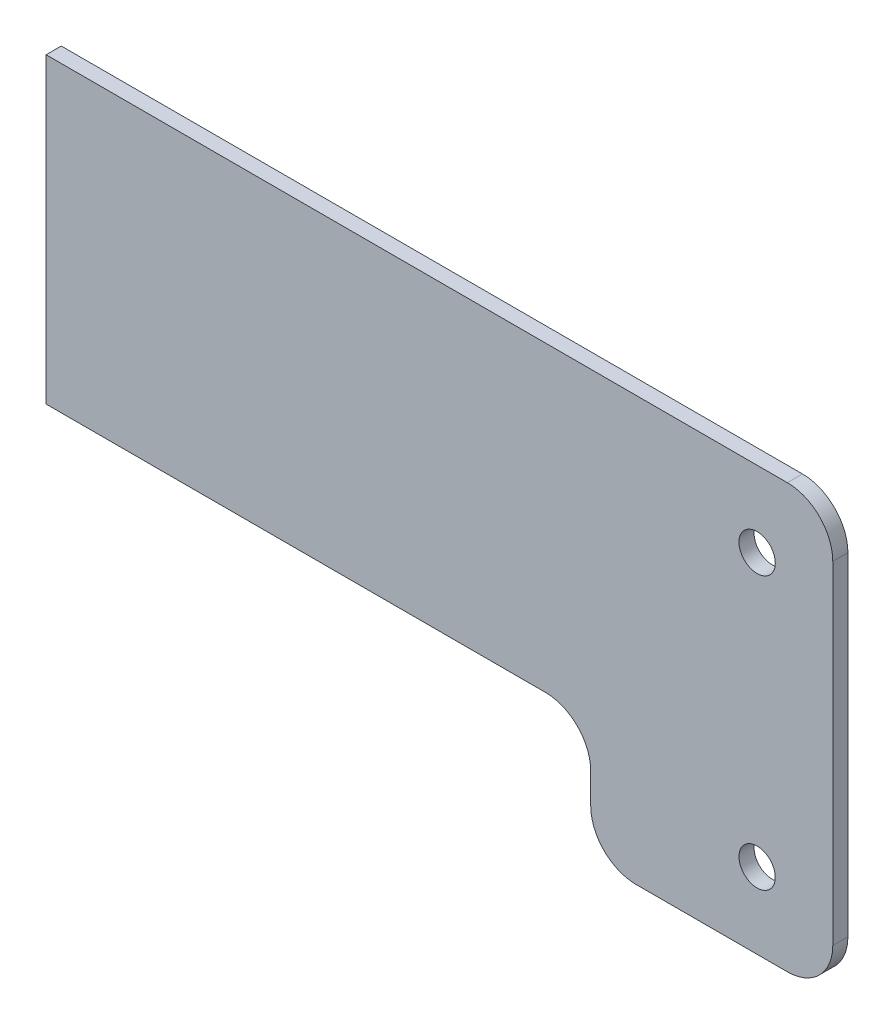
ISO-10303-21;
HEADER;
FILE_DESCRIPTION(('STEP AP214'),'2;1');
FILE_NAME('part.step','',(''),(''),'','','');
FILE_SCHEMA(('AUTOMOTIVE_DESIGN { 1 0 10303 214 1 1 1 1 }'));
ENDSEC;
DATA;
#1=APPLICATION_CONTEXT('core data for automotive mechanical design processes');
#2=APPLICATION_PROTOCOL_DEFINITION('international standard','automotive_design',2000,#1);
#3=PRODUCT_CONTEXT('',#1,'mechanical');
#4=PRODUCT('Part','Part','',(#3));
#5=PRODUCT_RELATED_PRODUCT_CATEGORY('part','',(#4));
#6=PRODUCT_DEFINITION_FORMATION('','',#4);
#7=PRODUCT_DEFINITION_CONTEXT('part definition',#1,'design');
#8=PRODUCT_DEFINITION('design','',#6,#7);
#9=PRODUCT_DEFINITION_SHAPE('','',#8);
#10=(LENGTH_UNIT() NAMED_UNIT(*) SI_UNIT(.MILLI.,.METRE.));
#11=(NAMED_UNIT(*) PLANE_ANGLE_UNIT() SI_UNIT($,.RADIAN.));
#12=(NAMED_UNIT(*) SI_UNIT($,.STERADIAN.) SOLID_ANGLE_UNIT());
#13=UNCERTAINTY_MEASURE_WITH_UNIT(LENGTH_MEASURE(1.E-05),#10,'distance_accuracy_value','');
#14=(GEOMETRIC_REPRESENTATION_CONTEXT(3) GLOBAL_UNCERTAINTY_ASSIGNED_CONTEXT((#13)) GLOBAL_UNIT_ASSIGNED_CONTEXT((#10,
#11,#12)) REPRESENTATION_CONTEXT('',''));
#15=CARTESIAN_POINT('',(0.,0.,0.));
#16=DIRECTION('',(0.,0.,1.));
#17=DIRECTION('',(1.,0.,0.));
#18=AXIS2_PLACEMENT_3D('',#15,#16,#17);
#19=CARTESIAN_POINT('',(42.5000000000001,-45.,2.5));
#20=DIRECTION('',(0.,0.,-1.));
#21=DIRECTION('',(-1.,0.,0.));
#22=AXIS2_PLACEMENT_3D('',#19,#20,#21);
#23=PLANE('',#22);
#24=DIRECTION('',(0.,-1.,0.));
#25=VECTOR('',#24,1.);
#26=CARTESIAN_POINT('',(-122.5,70.,2.5));
#27=LINE('',#26,#25);
#28=CARTESIAN_POINT('',(-122.5,70.,2.5));
#29=VERTEX_POINT('',#28);
#30=CARTESIAN_POINT('',(-122.5,-30.,2.5));
#31=VERTEX_POINT('',#30);
#32=EDGE_CURVE('E161',#29,#31,#27,.T.);
#33=ORIENTED_EDGE('',*,*,#32,.T.);
#34=DIRECTION('',(1.,0.,0.));
#35=VECTOR('',#34,1.);
#36=CARTESIAN_POINT('',(-122.5,-30.,2.5));
#37=LINE('',#36,#35);
#38=CARTESIAN_POINT('',(42.5000000000001,-30.,2.5));
#39=VERTEX_POINT('',#38);
#40=EDGE_CURVE('E99',#31,#39,#37,.T.);
#41=ORIENTED_EDGE('',*,*,#40,.T.);
#42=CARTESIAN_POINT('',(42.5000000000001,-45.,2.5));
#43=DIRECTION('',(0.,0.,-1.));
#44=DIRECTION('',(-1.,0.,0.));
#45=AXIS2_PLACEMENT_3D('',#42,#43,#44);
#46=CIRCLE('',#45,15.);
#47=CARTESIAN_POINT('',(57.5000000000001,-45.,2.5));
#48=VERTEX_POINT('',#47);
#49=EDGE_CURVE('E182',#39,#48,#46,.T.);
#50=ORIENTED_EDGE('',*,*,#49,.T.);
#51=DIRECTION('',(0.,-1.,0.));
#52=VECTOR('',#51,1.);
#53=CARTESIAN_POINT('',(57.5000000000001,-45.,2.5));
#54=LINE('',#53,#52);
#55=CARTESIAN_POINT('',(57.5000000000001,-55.,2.5));
#56=VERTEX_POINT('',#55);
#57=EDGE_CURVE('E201',#48,#56,#54,.T.);
#58=ORIENTED_EDGE('',*,*,#57,.T.);
#59=CARTESIAN_POINT('',(72.5000000000001,-55.,2.5));
#60=DIRECTION('',(0.,0.,1.));
#61=DIRECTION('',(1.,0.,0.));
#62=AXIS2_PLACEMENT_3D('',#59,#60,#61);
#63=CIRCLE('',#62,15.);
#64=CARTESIAN_POINT('',(72.5000000000001,-70.,2.5));
#65=VERTEX_POINT('',#64);
#66=EDGE_CURVE('E198',#56,#65,#63,.T.);
#67=ORIENTED_EDGE('',*,*,#66,.T.);
#68=DIRECTION('',(1.,0.,0.));
#69=VECTOR('',#68,1.);
#70=CARTESIAN_POINT('',(72.5000000000001,-70.,2.5));
#71=LINE('',#70,#69);
#72=CARTESIAN_POINT('',(122.5,-70.,2.5));
#73=VERTEX_POINT('',#72);
#74=EDGE_CURVE('E200',#65,#73,#71,.T.);
#75=ORIENTED_EDGE('',*,*,#74,.T.);
#76=CARTESIAN_POINT('',(122.5,-55.,2.5));
#77=DIRECTION('',(0.,0.,1.));
#78=DIRECTION('',(-1.,0.,0.));
#79=AXIS2_PLACEMENT_3D('',#76,#77,#78);
#80=CIRCLE('',#79,15.);
#81=CARTESIAN_POINT('',(137.5,-55.,2.5));
#82=VERTEX_POINT('',#81);
#83=EDGE_CURVE('E124',#73,#82,#80,.T.);
#84=ORIENTED_EDGE('',*,*,#83,.T.);
#85=DIRECTION('',(0.,1.,0.));
#86=VECTOR('',#85,1.);
#87=CARTESIAN_POINT('',(137.5,55.,2.5));
#88=LINE('',#87,#86);
#89=CARTESIAN_POINT('',(137.5,55.,2.5));
#90=VERTEX_POINT('',#89);
#91=EDGE_CURVE('E118',#82,#90,#88,.T.);
#92=ORIENTED_EDGE('',*,*,#91,.T.);
#93=CARTESIAN_POINT('',(122.5,55.,2.5));
#94=DIRECTION('',(0.,0.,1.));
#95=DIRECTION('',(-1.,0.,0.));
#96=AXIS2_PLACEMENT_3D('',#93,#94,#95);
#97=CIRCLE('',#96,15.);
#98=CARTESIAN_POINT('',(122.5,70.,2.5));
#99=VERTEX_POINT('',#98);
#100=EDGE_CURVE('E122',#90,#99,#97,.T.);
#101=ORIENTED_EDGE('',*,*,#100,.T.);
#102=DIRECTION('',(-1.,0.,0.));
#103=VECTOR('',#102,1.);
#104=CARTESIAN_POINT('',(-122.5,70.,2.5));
#105=LINE('',#104,#103);
#106=EDGE_CURVE('E50',#99,#29,#105,.T.);
#107=ORIENTED_EDGE('',*,*,#106,.T.);
#108=EDGE_LOOP('',(#33,#41,#50,#58,#67,#75,#84,#92,#101,#107));
#109=FACE_BOUND('',#108,.T.);
#110=CARTESIAN_POINT('',(112.5,45.,2.5));
#111=DIRECTION('',(0.,0.,1.));
#112=DIRECTION('',(1.,0.,0.));
#113=AXIS2_PLACEMENT_3D('',#110,#111,#112);
#114=CIRCLE('',#113,6.);
#115=CARTESIAN_POINT('',(118.5,45.,2.5));
#116=VERTEX_POINT('',#115);
#117=EDGE_CURVE('E146',#116,#116,#114,.T.);
#118=ORIENTED_EDGE('',*,*,#117,.F.);
#119=EDGE_LOOP('',(#118));
#120=FACE_BOUND('',#119,.T.);
#121=CARTESIAN_POINT('',(112.5,-45.,2.5));
#122=DIRECTION('',(0.,0.,1.));
#123=DIRECTION('',(-1.,0.,0.));
#124=AXIS2_PLACEMENT_3D('',#121,#122,#123);
#125=CIRCLE('',#124,6.);
#126=CARTESIAN_POINT('',(106.5,-45.,2.5));
#127=VERTEX_POINT('',#126);
#128=EDGE_CURVE('E212',#127,#127,#125,.T.);
#129=ORIENTED_EDGE('',*,*,#128,.F.);
#130=EDGE_LOOP('',(#129));
#131=FACE_BOUND('',#130,.T.);
#132=ADVANCED_FACE('F33',(#109,#120,#131),#23,.F.);
#133=CARTESIAN_POINT('',(42.5000000000001,-45.,-2.5));
#134=DIRECTION('',(0.,0.,-1.));
#135=DIRECTION('',(-1.,0.,0.));
#136=AXIS2_PLACEMENT_3D('',#133,#134,#135);
#137=PLANE('',#136);
#138=CARTESIAN_POINT('',(112.5,45.,-2.5));
#139=DIRECTION('',(0.,0.,1.));
#140=DIRECTION('',(1.,0.,0.));
#141=AXIS2_PLACEMENT_3D('',#138,#139,#140);
#142=CIRCLE('',#141,6.);
#143=CARTESIAN_POINT('',(118.5,45.,-2.5));
#144=VERTEX_POINT('',#143);
#145=EDGE_CURVE('E209',#144,#144,#142,.T.);
#146=ORIENTED_EDGE('',*,*,#145,.T.);
#147=EDGE_LOOP('',(#146));
#148=FACE_BOUND('',#147,.T.);
#149=DIRECTION('',(0.,-1.,0.));
#150=VECTOR('',#149,1.);
#151=CARTESIAN_POINT('',(-122.5,70.,-2.5));
#152=LINE('',#151,#150);
#153=CARTESIAN_POINT('',(-122.5,70.,-2.5));
#154=VERTEX_POINT('',#153);
#155=CARTESIAN_POINT('',(-122.5,-30.,-2.5));
#156=VERTEX_POINT('',#155);
#157=EDGE_CURVE('E142',#154,#156,#152,.T.);
#158=ORIENTED_EDGE('',*,*,#157,.F.);
#159=DIRECTION('',(-1.,0.,0.));
#160=VECTOR('',#159,1.);
#161=CARTESIAN_POINT('',(-122.5,70.,-2.5));
#162=LINE('',#161,#160);
#163=CARTESIAN_POINT('',(122.5,70.,-2.5));
#164=VERTEX_POINT('',#163);
#165=EDGE_CURVE('E91',#164,#154,#162,.T.);
#166=ORIENTED_EDGE('',*,*,#165,.F.);
#167=CARTESIAN_POINT('',(122.5,55.,-2.5));
#168=DIRECTION('',(0.,0.,1.));
#169=DIRECTION('',(-1.,0.,0.));
#170=AXIS2_PLACEMENT_3D('',#167,#168,#169);
#171=CIRCLE('',#170,15.);
#172=CARTESIAN_POINT('',(137.5,55.,-2.5));
#173=VERTEX_POINT('',#172);
#174=EDGE_CURVE('E85',#173,#164,#171,.T.);
#175=ORIENTED_EDGE('',*,*,#174,.F.);
#176=DIRECTION('',(0.,1.,0.));
#177=VECTOR('',#176,1.);
#178=CARTESIAN_POINT('',(137.5,55.,-2.5));
#179=LINE('',#178,#177);
#180=CARTESIAN_POINT('',(137.5,-55.,-2.5));
#181=VERTEX_POINT('',#180);
#182=EDGE_CURVE('E132',#181,#173,#179,.T.);
#183=ORIENTED_EDGE('',*,*,#182,.F.);
#184=CARTESIAN_POINT('',(122.5,-55.,-2.5));
#185=DIRECTION('',(0.,0.,1.));
#186=DIRECTION('',(-1.,0.,0.));
#187=AXIS2_PLACEMENT_3D('',#184,#185,#186);
#188=CIRCLE('',#187,15.);
#189=CARTESIAN_POINT('',(122.5,-70.,-2.5));
#190=VERTEX_POINT('',#189);
#191=EDGE_CURVE('E156',#190,#181,#188,.T.);
#192=ORIENTED_EDGE('',*,*,#191,.F.);
#193=DIRECTION('',(1.,0.,0.));
#194=VECTOR('',#193,1.);
#195=CARTESIAN_POINT('',(72.5000000000001,-70.,-2.5));
#196=LINE('',#195,#194);
#197=CARTESIAN_POINT('',(72.5000000000001,-70.,-2.5));
#198=VERTEX_POINT('',#197);
#199=EDGE_CURVE('E154',#198,#190,#196,.T.);
#200=ORIENTED_EDGE('',*,*,#199,.F.);
#201=CARTESIAN_POINT('',(72.5000000000001,-55.,-2.5));
#202=DIRECTION('',(0.,0.,1.));
#203=DIRECTION('',(1.,0.,0.));
#204=AXIS2_PLACEMENT_3D('',#201,#202,#203);
#205=CIRCLE('',#204,15.);
#206=CARTESIAN_POINT('',(57.5000000000001,-55.,-2.5));
#207=VERTEX_POINT('',#206);
#208=EDGE_CURVE('E152',#207,#198,#205,.T.);
#209=ORIENTED_EDGE('',*,*,#208,.F.);
#210=DIRECTION('',(0.,-1.,0.));
#211=VECTOR('',#210,1.);
#212=CARTESIAN_POINT('',(57.5000000000001,-45.,-2.5));
#213=LINE('',#212,#211);
#214=CARTESIAN_POINT('',(57.5000000000001,-45.,-2.5));
#215=VERTEX_POINT('',#214);
#216=EDGE_CURVE('E150',#215,#207,#213,.T.);
#217=ORIENTED_EDGE('',*,*,#216,.F.);
#218=CARTESIAN_POINT('',(42.5000000000001,-45.,-2.5));
#219=DIRECTION('',(0.,0.,-1.));
#220=DIRECTION('',(-1.,0.,0.));
#221=AXIS2_PLACEMENT_3D('',#218,#219,#220);
#222=CIRCLE('',#221,15.);
#223=CARTESIAN_POINT('',(42.5000000000001,-30.,-2.5));
#224=VERTEX_POINT('',#223);
#225=EDGE_CURVE('E148',#224,#215,#222,.T.);
#226=ORIENTED_EDGE('',*,*,#225,.F.);
#227=DIRECTION('',(1.,0.,0.));
#228=VECTOR('',#227,1.);
#229=CARTESIAN_POINT('',(-122.5,-30.,-2.5));
#230=LINE('',#229,#228);
#231=EDGE_CURVE('E145',#156,#224,#230,.T.);
#232=ORIENTED_EDGE('',*,*,#231,.F.);
#233=EDGE_LOOP('',(#158,#166,#175,#183,#192,#200,#209,#217,#226,#232));
#234=FACE_BOUND('',#233,.T.);
#235=CARTESIAN_POINT('',(112.5,-45.,-2.5));
#236=DIRECTION('',(0.,0.,1.));
#237=DIRECTION('',(-1.,0.,0.));
#238=AXIS2_PLACEMENT_3D('',#235,#236,#237);
#239=CIRCLE('',#238,6.);
#240=CARTESIAN_POINT('',(106.5,-45.,-2.5));
#241=VERTEX_POINT('',#240);
#242=EDGE_CURVE('E215',#241,#241,#239,.T.);
#243=ORIENTED_EDGE('',*,*,#242,.T.);
#244=EDGE_LOOP('',(#243));
#245=FACE_BOUND('',#244,.T.);
#246=ADVANCED_FACE('F186',(#148,#234,#245),#137,.T.);
#247=CARTESIAN_POINT('',(-122.5,70.,2.5));
#248=DIRECTION('',(1.,0.,0.));
#249=DIRECTION('',(0.,0.,-1.));
#250=AXIS2_PLACEMENT_3D('',#247,#248,#249);
#251=PLANE('',#250);
#252=ORIENTED_EDGE('',*,*,#157,.T.);
#253=DIRECTION('',(0.,0.,-1.));
#254=VECTOR('',#253,1.);
#255=CARTESIAN_POINT('',(-122.5,-30.,2.5));
#256=LINE('',#255,#254);
#257=EDGE_CURVE('E11',#31,#156,#256,.T.);
#258=ORIENTED_EDGE('',*,*,#257,.F.);
#259=ORIENTED_EDGE('',*,*,#32,.F.);
#260=DIRECTION('',(0.,0.,-1.));
#261=VECTOR('',#260,1.);
#262=CARTESIAN_POINT('',(-122.5,70.,2.5));
#263=LINE('',#262,#261);
#264=EDGE_CURVE('E138',#29,#154,#263,.T.);
#265=ORIENTED_EDGE('',*,*,#264,.T.);
#266=EDGE_LOOP('',(#252,#258,#259,#265));
#267=FACE_BOUND('',#266,.T.);
#268=ADVANCED_FACE('F35',(#267),#251,.F.);
#269=CARTESIAN_POINT('',(-122.5,-30.,2.5));
#270=DIRECTION('',(0.,1.,0.));
#271=DIRECTION('',(-1.,0.,0.));
#272=AXIS2_PLACEMENT_3D('',#269,#270,#271);
#273=PLANE('',#272);
#274=ORIENTED_EDGE('',*,*,#231,.T.);
#275=DIRECTION('',(0.,0.,-1.));
#276=VECTOR('',#275,1.);
#277=CARTESIAN_POINT('',(42.5000000000001,-30.,2.5));
#278=LINE('',#277,#276);
#279=EDGE_CURVE('E42',#39,#224,#278,.T.);
#280=ORIENTED_EDGE('',*,*,#279,.F.);
#281=ORIENTED_EDGE('',*,*,#40,.F.);
#282=ORIENTED_EDGE('',*,*,#257,.T.);
#283=EDGE_LOOP('',(#274,#280,#281,#282));
#284=FACE_BOUND('',#283,.T.);
#285=ADVANCED_FACE('F255',(#284),#273,.F.);
#286=CARTESIAN_POINT('',(42.5000000000001,-45.,2.5));
#287=DIRECTION('',(0.,0.,-1.));
#288=DIRECTION('',(-1.,0.,0.));
#289=AXIS2_PLACEMENT_3D('',#286,#287,#288);
#290=CYLINDRICAL_SURFACE('',#289,15.);
#291=ORIENTED_EDGE('',*,*,#225,.T.);
#292=DIRECTION('',(0.,0.,-1.));
#293=VECTOR('',#292,1.);
#294=CARTESIAN_POINT('',(57.5000000000001,-45.,2.5));
#295=LINE('',#294,#293);
#296=EDGE_CURVE('E174',#48,#215,#295,.T.);
#297=ORIENTED_EDGE('',*,*,#296,.F.);
#298=ORIENTED_EDGE('',*,*,#49,.F.);
#299=ORIENTED_EDGE('',*,*,#279,.T.);
#300=EDGE_LOOP('',(#291,#297,#298,#299));
#301=FACE_BOUND('',#300,.T.);
#302=ADVANCED_FACE('F180',(#301),#290,.F.);
#303=CARTESIAN_POINT('',(57.5000000000001,-45.,2.5));
#304=DIRECTION('',(1.,0.,0.));
#305=DIRECTION('',(0.,1.,0.));
#306=AXIS2_PLACEMENT_3D('',#303,#304,#305);
#307=PLANE('',#306);
#308=ORIENTED_EDGE('',*,*,#216,.T.);
#309=DIRECTION('',(0.,0.,-1.));
#310=VECTOR('',#309,1.);
#311=CARTESIAN_POINT('',(57.5000000000001,-55.,2.5));
#312=LINE('',#311,#310);
#313=EDGE_CURVE('E171',#56,#207,#312,.T.);
#314=ORIENTED_EDGE('',*,*,#313,.F.);
#315=ORIENTED_EDGE('',*,*,#57,.F.);
#316=ORIENTED_EDGE('',*,*,#296,.T.);
#317=EDGE_LOOP('',(#308,#314,#315,#316));
#318=FACE_BOUND('',#317,.T.);
#319=ADVANCED_FACE('F192',(#318),#307,.F.);
#320=CARTESIAN_POINT('',(72.5000000000001,-55.,2.5));
#321=DIRECTION('',(0.,0.,-1.));
#322=DIRECTION('',(-1.,0.,0.));
#323=AXIS2_PLACEMENT_3D('',#320,#321,#322);
#324=CYLINDRICAL_SURFACE('',#323,15.);
#325=ORIENTED_EDGE('',*,*,#208,.T.);
#326=DIRECTION('',(0.,0.,-1.));
#327=VECTOR('',#326,1.);
#328=CARTESIAN_POINT('',(72.5000000000001,-70.,2.5));
#329=LINE('',#328,#327);
#330=EDGE_CURVE('E168',#65,#198,#329,.T.);
#331=ORIENTED_EDGE('',*,*,#330,.F.);
#332=ORIENTED_EDGE('',*,*,#66,.F.);
#333=ORIENTED_EDGE('',*,*,#313,.T.);
#334=EDGE_LOOP('',(#325,#331,#332,#333));
#335=FACE_BOUND('',#334,.T.);
#336=ADVANCED_FACE('F196',(#335),#324,.T.);
#337=CARTESIAN_POINT('',(72.5000000000001,-70.,2.5));
#338=DIRECTION('',(0.,1.,0.));
#339=DIRECTION('',(-1.,0.,0.));
#340=AXIS2_PLACEMENT_3D('',#337,#338,#339);
#341=PLANE('',#340);
#342=ORIENTED_EDGE('',*,*,#199,.T.);
#343=DIRECTION('',(0.,0.,-1.));
#344=VECTOR('',#343,1.);
#345=CARTESIAN_POINT('',(122.5,-70.,2.5));
#346=LINE('',#345,#344);
#347=EDGE_CURVE('E165',#73,#190,#346,.T.);
#348=ORIENTED_EDGE('',*,*,#347,.F.);
#349=ORIENTED_EDGE('',*,*,#74,.F.);
#350=ORIENTED_EDGE('',*,*,#330,.T.);
#351=EDGE_LOOP('',(#342,#348,#349,#350));
#352=FACE_BOUND('',#351,.T.);
#353=ADVANCED_FACE('F245',(#352),#341,.F.);
#354=CARTESIAN_POINT('',(122.5,-55.,2.5));
#355=DIRECTION('',(0.,0.,-1.));
#356=DIRECTION('',(-1.,0.,0.));
#357=AXIS2_PLACEMENT_3D('',#354,#355,#356);
#358=CYLINDRICAL_SURFACE('',#357,15.);
#359=ORIENTED_EDGE('',*,*,#191,.T.);
#360=DIRECTION('',(0.,0.,-1.));
#361=VECTOR('',#360,1.);
#362=CARTESIAN_POINT('',(137.5,-55.,2.5));
#363=LINE('',#362,#361);
#364=EDGE_CURVE('E133',#82,#181,#363,.T.);
#365=ORIENTED_EDGE('',*,*,#364,.F.);
#366=ORIENTED_EDGE('',*,*,#83,.F.);
#367=ORIENTED_EDGE('',*,*,#347,.T.);
#368=EDGE_LOOP('',(#359,#365,#366,#367));
#369=FACE_BOUND('',#368,.T.);
#370=ADVANCED_FACE('F242',(#369),#358,.T.);
#371=CARTESIAN_POINT('',(137.5,55.,2.5));
#372=DIRECTION('',(-1.,0.,0.));
#373=DIRECTION('',(0.,0.,1.));
#374=AXIS2_PLACEMENT_3D('',#371,#372,#373);
#375=PLANE('',#374);
#376=ORIENTED_EDGE('',*,*,#182,.T.);
#377=DIRECTION('',(0.,0.,-1.));
#378=VECTOR('',#377,1.);
#379=CARTESIAN_POINT('',(137.5,55.,2.5));
#380=LINE('',#379,#378);
#381=EDGE_CURVE('E129',#90,#173,#380,.T.);
#382=ORIENTED_EDGE('',*,*,#381,.F.);
#383=ORIENTED_EDGE('',*,*,#91,.F.);
#384=ORIENTED_EDGE('',*,*,#364,.T.);
#385=EDGE_LOOP('',(#376,#382,#383,#384));
#386=FACE_BOUND('',#385,.T.);
#387=ADVANCED_FACE('F130',(#386),#375,.F.);
#388=CARTESIAN_POINT('',(122.5,55.,2.5));
#389=DIRECTION('',(0.,0.,-1.));
#390=DIRECTION('',(-1.,0.,0.));
#391=AXIS2_PLACEMENT_3D('',#388,#389,#390);
#392=CYLINDRICAL_SURFACE('',#391,15.);
#393=ORIENTED_EDGE('',*,*,#174,.T.);
#394=DIRECTION('',(0.,0.,-1.));
#395=VECTOR('',#394,1.);
#396=CARTESIAN_POINT('',(122.5,70.,2.5));
#397=LINE('',#396,#395);
#398=EDGE_CURVE('E134',#99,#164,#397,.T.);
#399=ORIENTED_EDGE('',*,*,#398,.F.);
#400=ORIENTED_EDGE('',*,*,#100,.F.);
#401=ORIENTED_EDGE('',*,*,#381,.T.);
#402=EDGE_LOOP('',(#393,#399,#400,#401));
#403=FACE_BOUND('',#402,.T.);
#404=ADVANCED_FACE('F136',(#403),#392,.T.);
#405=CARTESIAN_POINT('',(-122.5,70.,2.5));
#406=DIRECTION('',(0.,-1.,0.));
#407=DIRECTION('',(0.,0.,-1.));
#408=AXIS2_PLACEMENT_3D('',#405,#406,#407);
#409=PLANE('',#408);
#410=ORIENTED_EDGE('',*,*,#165,.T.);
#411=ORIENTED_EDGE('',*,*,#264,.F.);
#412=ORIENTED_EDGE('',*,*,#106,.F.);
#413=ORIENTED_EDGE('',*,*,#398,.T.);
#414=EDGE_LOOP('',(#410,#411,#412,#413));
#415=FACE_BOUND('',#414,.T.);
#416=ADVANCED_FACE('F235',(#415),#409,.F.);
#417=CARTESIAN_POINT('',(112.5,45.,2.5));
#418=DIRECTION('',(0.,0.,-1.));
#419=DIRECTION('',(-1.,0.,0.));
#420=AXIS2_PLACEMENT_3D('',#417,#418,#419);
#421=CYLINDRICAL_SURFACE('',#420,6.);
#422=ORIENTED_EDGE('',*,*,#117,.T.);
#423=EDGE_LOOP('',(#422));
#424=FACE_BOUND('',#423,.T.);
#425=ORIENTED_EDGE('',*,*,#145,.F.);
#426=EDGE_LOOP('',(#425));
#427=FACE_BOUND('',#426,.T.);
#428=ADVANCED_FACE('F232',(#424,#427),#421,.F.);
#429=CARTESIAN_POINT('',(112.5,-45.,2.5));
#430=DIRECTION('',(0.,0.,-1.));
#431=DIRECTION('',(-1.,0.,0.));
#432=AXIS2_PLACEMENT_3D('',#429,#430,#431);
#433=CYLINDRICAL_SURFACE('',#432,6.);
#434=ORIENTED_EDGE('',*,*,#128,.T.);
#435=EDGE_LOOP('',(#434));
#436=FACE_BOUND('',#435,.T.);
#437=ORIENTED_EDGE('',*,*,#242,.F.);
#438=EDGE_LOOP('',(#437));
#439=FACE_BOUND('',#438,.T.);
#440=ADVANCED_FACE('F221',(#436,#439),#433,.F.);
#441=CLOSED_SHELL('',(#132,#246,#268,#285,#302,#319,#336,#353,#370,#387,#404,#416,#428,#440));
#442=MANIFOLD_SOLID_BREP('B2',#441);
#443=ADVANCED_BREP_SHAPE_REPRESENTATION('',(#18,#442),#14);
#444=SHAPE_DEFINITION_REPRESENTATION(#9,#443);
ENDSEC;
END-ISO-10303-21;
